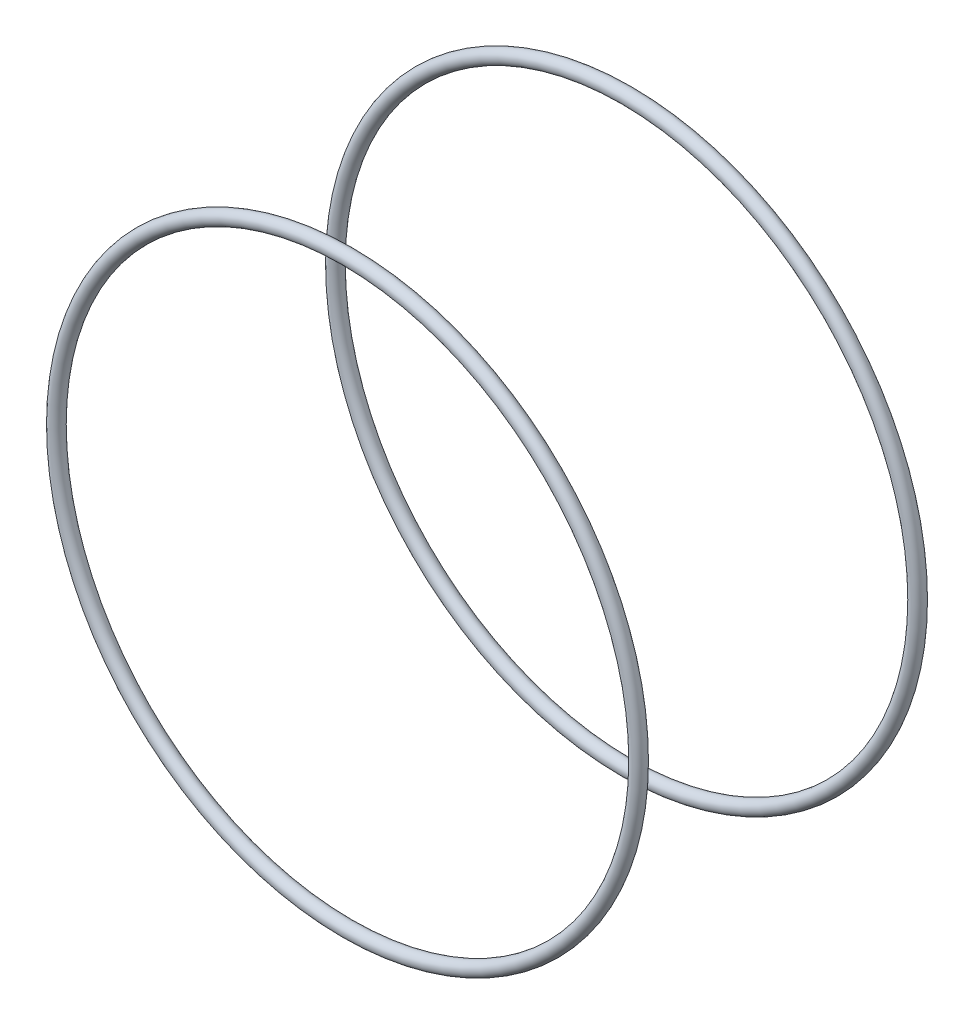
ISO-10303-21;
HEADER;
FILE_DESCRIPTION(('STEP AP214'),'2;1');
FILE_NAME('part.step','',(''),(''),'','','');
FILE_SCHEMA(('AUTOMOTIVE_DESIGN { 1 0 10303 214 1 1 1 1 }'));
ENDSEC;
DATA;
#1=APPLICATION_CONTEXT('core data for automotive mechanical design processes');
#2=APPLICATION_PROTOCOL_DEFINITION('international standard','automotive_design',2000,#1);
#3=PRODUCT_CONTEXT('',#1,'mechanical');
#4=PRODUCT('Part','Part','',(#3));
#5=PRODUCT_RELATED_PRODUCT_CATEGORY('part','',(#4));
#6=PRODUCT_DEFINITION_FORMATION('','',#4);
#7=PRODUCT_DEFINITION_CONTEXT('part definition',#1,'design');
#8=PRODUCT_DEFINITION('design','',#6,#7);
#9=PRODUCT_DEFINITION_SHAPE('','',#8);
#10=(LENGTH_UNIT() NAMED_UNIT(*) SI_UNIT(.MILLI.,.METRE.));
#11=(NAMED_UNIT(*) PLANE_ANGLE_UNIT() SI_UNIT($,.RADIAN.));
#12=(NAMED_UNIT(*) SI_UNIT($,.STERADIAN.) SOLID_ANGLE_UNIT());
#13=UNCERTAINTY_MEASURE_WITH_UNIT(LENGTH_MEASURE(1.E-05),#10,'distance_accuracy_value','');
#14=(GEOMETRIC_REPRESENTATION_CONTEXT(3) GLOBAL_UNCERTAINTY_ASSIGNED_CONTEXT((#13)) GLOBAL_UNIT_ASSIGNED_CONTEXT((#10,
#11,#12)) REPRESENTATION_CONTEXT('',''));
#15=CARTESIAN_POINT('',(0.,0.,0.));
#16=DIRECTION('',(0.,0.,1.));
#17=DIRECTION('',(1.,0.,0.));
#18=AXIS2_PLACEMENT_3D('',#15,#16,#17);
#19=CARTESIAN_POINT('',(0.,0.,1.2));
#20=DIRECTION('',(0.,0.,-1.));
#21=DIRECTION('',(1.,0.,0.));
#22=AXIS2_PLACEMENT_3D('',#19,#20,#21);
#23=TOROIDAL_SURFACE('',#22,3.13,0.075);
#24=ADVANCED_FACE('P0_F14',(),#23,.T.);
#25=CLOSED_SHELL('',(#24));
#26=MANIFOLD_SOLID_BREP('P0_B1',#25);
#27=CARTESIAN_POINT('',(0.,0.,4.2));
#28=DIRECTION('',(0.,0.,-1.));
#29=DIRECTION('',(1.,0.,0.));
#30=AXIS2_PLACEMENT_3D('',#27,#28,#29);
#31=TOROIDAL_SURFACE('',#30,3.13,0.075);
#32=ADVANCED_FACE('P1_F14',(),#31,.T.);
#33=CLOSED_SHELL('',(#32));
#34=MANIFOLD_SOLID_BREP('P1_B1',#33);
#35=ADVANCED_BREP_SHAPE_REPRESENTATION('',(#18,#26,#34),#14);
#36=SHAPE_DEFINITION_REPRESENTATION(#9,#35);
ENDSEC;
END-ISO-10303-21;
